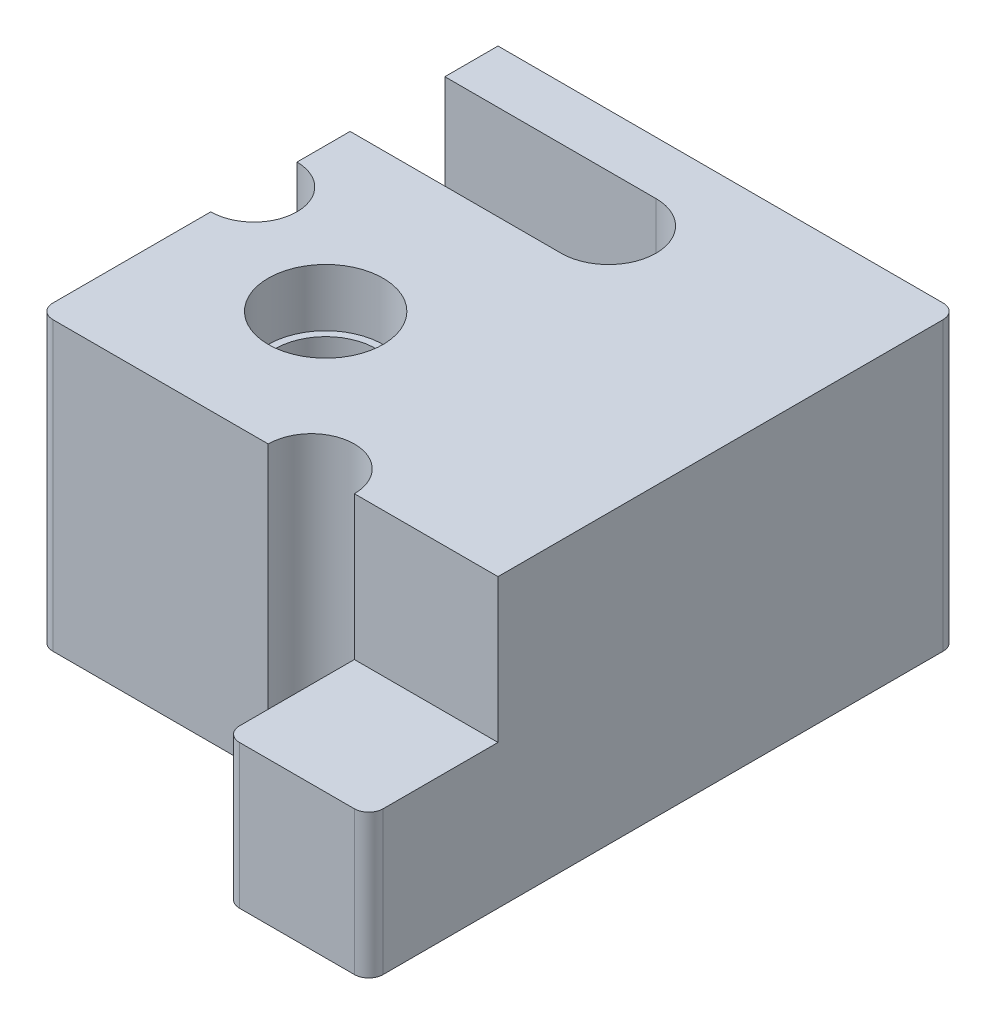
ISO-10303-21;
HEADER;
FILE_DESCRIPTION(('STEP AP214'),'2;1');
FILE_NAME('part.step','',(''),(''),'','','');
FILE_SCHEMA(('AUTOMOTIVE_DESIGN { 1 0 10303 214 1 1 1 1 }'));
ENDSEC;
DATA;
#1=APPLICATION_CONTEXT('core data for automotive mechanical design processes');
#2=APPLICATION_PROTOCOL_DEFINITION('international standard','automotive_design',2000,#1);
#3=PRODUCT_CONTEXT('',#1,'mechanical');
#4=PRODUCT('Part','Part','',(#3));
#5=PRODUCT_RELATED_PRODUCT_CATEGORY('part','',(#4));
#6=PRODUCT_DEFINITION_FORMATION('','',#4);
#7=PRODUCT_DEFINITION_CONTEXT('part definition',#1,'design');
#8=PRODUCT_DEFINITION('design','',#6,#7);
#9=PRODUCT_DEFINITION_SHAPE('','',#8);
#10=(LENGTH_UNIT() NAMED_UNIT(*) SI_UNIT(.MILLI.,.METRE.));
#11=(NAMED_UNIT(*) PLANE_ANGLE_UNIT() SI_UNIT($,.RADIAN.));
#12=(NAMED_UNIT(*) SI_UNIT($,.STERADIAN.) SOLID_ANGLE_UNIT());
#13=UNCERTAINTY_MEASURE_WITH_UNIT(LENGTH_MEASURE(1.E-05),#10,'distance_accuracy_value','');
#14=(GEOMETRIC_REPRESENTATION_CONTEXT(3) GLOBAL_UNCERTAINTY_ASSIGNED_CONTEXT((#13)) GLOBAL_UNIT_ASSIGNED_CONTEXT((#10,
#11,#12)) REPRESENTATION_CONTEXT('',''));
#15=CARTESIAN_POINT('',(0.,0.,0.));
#16=DIRECTION('',(0.,0.,1.));
#17=DIRECTION('',(1.,0.,0.));
#18=AXIS2_PLACEMENT_3D('',#15,#16,#17);
#19=CARTESIAN_POINT('',(1.,5.,7.));
#20=DIRECTION('',(1.,0.,0.));
#21=DIRECTION('',(0.,0.,-1.));
#22=AXIS2_PLACEMENT_3D('',#19,#20,#21);
#23=PLANE('',#22);
#24=DIRECTION('',(0.,0.,-1.));
#25=VECTOR('',#24,1.);
#26=CARTESIAN_POINT('',(1.,10.,7.));
#27=LINE('',#26,#25);
#28=CARTESIAN_POINT('',(1.,10.,7.));
#29=VERTEX_POINT('',#28);
#30=CARTESIAN_POINT('',(1.,10.,5.15));
#31=VERTEX_POINT('',#30);
#32=EDGE_CURVE('E272',#29,#31,#27,.T.);
#33=ORIENTED_EDGE('',*,*,#32,.T.);
#34=DIRECTION('',(0.,-1.,0.));
#35=VECTOR('',#34,1.);
#36=CARTESIAN_POINT('',(1.,5.,5.15));
#37=LINE('',#36,#35);
#38=CARTESIAN_POINT('',(1.,5.,5.15));
#39=VERTEX_POINT('',#38);
#40=EDGE_CURVE('E254',#31,#39,#37,.T.);
#41=ORIENTED_EDGE('',*,*,#40,.T.);
#42=DIRECTION('',(0.,0.,-1.));
#43=VECTOR('',#42,1.);
#44=CARTESIAN_POINT('',(1.,5.,7.));
#45=LINE('',#44,#43);
#46=CARTESIAN_POINT('',(1.,5.,7.));
#47=VERTEX_POINT('',#46);
#48=EDGE_CURVE('E258',#47,#39,#45,.T.);
#49=ORIENTED_EDGE('',*,*,#48,.F.);
#50=DIRECTION('',(0.,-1.,0.));
#51=VECTOR('',#50,1.);
#52=CARTESIAN_POINT('',(1.,10.,7.));
#53=LINE('',#52,#51);
#54=EDGE_CURVE('E351',#29,#47,#53,.T.);
#55=ORIENTED_EDGE('',*,*,#54,.F.);
#56=EDGE_LOOP('',(#33,#41,#49,#55));
#57=FACE_BOUND('',#56,.T.);
#58=ADVANCED_FACE('F34',(#57),#23,.F.);
#59=CARTESIAN_POINT('',(0.,5.,0.));
#60=DIRECTION('',(0.,1.,0.));
#61=DIRECTION('',(0.,0.,1.));
#62=AXIS2_PLACEMENT_3D('',#59,#60,#61);
#63=PLANE('',#62);
#64=DIRECTION('',(1.,0.,0.));
#65=VECTOR('',#64,1.);
#66=CARTESIAN_POINT('',(0.,5.,5.15));
#67=LINE('',#66,#65);
#68=CARTESIAN_POINT('',(0.5,5.,5.15));
#69=VERTEX_POINT('',#68);
#70=EDGE_CURVE('E358',#69,#39,#67,.T.);
#71=ORIENTED_EDGE('',*,*,#70,.F.);
#72=CARTESIAN_POINT('',(0.5,5.,5.65));
#73=DIRECTION('',(0.,1.,0.));
#74=DIRECTION('',(0.,0.,1.));
#75=AXIS2_PLACEMENT_3D('',#72,#73,#74);
#76=CIRCLE('',#75,0.5);
#77=CARTESIAN_POINT('',(0.,5.,5.65));
#78=VERTEX_POINT('',#77);
#79=EDGE_CURVE('E367',#69,#78,#76,.T.);
#80=ORIENTED_EDGE('',*,*,#79,.T.);
#81=DIRECTION('',(0.,0.,1.));
#82=VECTOR('',#81,1.);
#83=CARTESIAN_POINT('',(0.,5.,7.));
#84=LINE('',#83,#82);
#85=CARTESIAN_POINT('',(0.,5.,6.5));
#86=VERTEX_POINT('',#85);
#87=EDGE_CURVE('E265',#78,#86,#84,.T.);
#88=ORIENTED_EDGE('',*,*,#87,.T.);
#89=CARTESIAN_POINT('',(0.500000000000001,5.,6.5));
#90=DIRECTION('',(0.,1.,0.));
#91=DIRECTION('',(0.,0.,1.));
#92=AXIS2_PLACEMENT_3D('',#89,#90,#91);
#93=CIRCLE('',#92,0.5);
#94=CARTESIAN_POINT('',(0.500000000000001,5.,7.));
#95=VERTEX_POINT('',#94);
#96=EDGE_CURVE('E365',#86,#95,#93,.T.);
#97=ORIENTED_EDGE('',*,*,#96,.T.);
#98=DIRECTION('',(1.,0.,0.));
#99=VECTOR('',#98,1.);
#100=CARTESIAN_POINT('',(1.,5.,7.));
#101=LINE('',#100,#99);
#102=EDGE_CURVE('E269',#95,#47,#101,.T.);
#103=ORIENTED_EDGE('',*,*,#102,.T.);
#104=ORIENTED_EDGE('',*,*,#48,.T.);
#105=EDGE_LOOP('',(#71,#80,#88,#97,#103,#104));
#106=FACE_BOUND('',#105,.T.);
#107=ADVANCED_FACE('F438',(#106),#63,.T.);
#108=CARTESIAN_POINT('',(0.,10.,0.));
#109=DIRECTION('',(1.,0.,0.));
#110=DIRECTION('',(0.,0.,-1.));
#111=AXIS2_PLACEMENT_3D('',#108,#109,#110);
#112=PLANE('',#111);
#113=ORIENTED_EDGE('',*,*,#87,.F.);
#114=DIRECTION('',(0.,1.,0.));
#115=VECTOR('',#114,1.);
#116=CARTESIAN_POINT('',(0.,10.,5.65));
#117=LINE('',#116,#115);
#118=CARTESIAN_POINT('',(0.,1.,5.65));
#119=VERTEX_POINT('',#118);
#120=EDGE_CURVE('E377',#78,#119,#117,.F.);
#121=ORIENTED_EDGE('',*,*,#120,.T.);
#122=DIRECTION('',(0.,0.,1.));
#123=VECTOR('',#122,1.);
#124=CARTESIAN_POINT('',(0.,1.,0.));
#125=LINE('',#124,#123);
#126=CARTESIAN_POINT('',(0.,1.,1.35));
#127=VERTEX_POINT('',#126);
#128=EDGE_CURVE('E360',#127,#119,#125,.T.);
#129=ORIENTED_EDGE('',*,*,#128,.F.);
#130=DIRECTION('',(0.,1.,0.));
#131=VECTOR('',#130,1.);
#132=CARTESIAN_POINT('',(0.,10.,1.35));
#133=LINE('',#132,#131);
#134=CARTESIAN_POINT('',(0.,5.,1.35));
#135=VERTEX_POINT('',#134);
#136=EDGE_CURVE('E374',#127,#135,#133,.T.);
#137=ORIENTED_EDGE('',*,*,#136,.T.);
#138=CARTESIAN_POINT('',(0.,5.,0.500000000000002));
#139=VERTEX_POINT('',#138);
#140=EDGE_CURVE('E266',#139,#135,#84,.T.);
#141=ORIENTED_EDGE('',*,*,#140,.F.);
#142=DIRECTION('',(0.,-1.,0.));
#143=VECTOR('',#142,1.);
#144=CARTESIAN_POINT('',(0.,10.,0.5));
#145=LINE('',#144,#143);
#146=CARTESIAN_POINT('',(0.,0.,0.5));
#147=VERTEX_POINT('',#146);
#148=EDGE_CURVE('E371',#139,#147,#145,.T.);
#149=ORIENTED_EDGE('',*,*,#148,.T.);
#150=DIRECTION('',(0.,0.,1.));
#151=VECTOR('',#150,1.);
#152=CARTESIAN_POINT('',(0.,0.,0.));
#153=LINE('',#152,#151);
#154=CARTESIAN_POINT('',(0.,0.,6.5));
#155=VERTEX_POINT('',#154);
#156=EDGE_CURVE('E335',#147,#155,#153,.T.);
#157=ORIENTED_EDGE('',*,*,#156,.T.);
#158=DIRECTION('',(0.,-1.,0.));
#159=VECTOR('',#158,1.);
#160=CARTESIAN_POINT('',(0.,10.,6.5));
#161=LINE('',#160,#159);
#162=EDGE_CURVE('E369',#155,#86,#161,.F.);
#163=ORIENTED_EDGE('',*,*,#162,.T.);
#164=EDGE_LOOP('',(#113,#121,#129,#137,#141,#149,#157,#163));
#165=FACE_BOUND('',#164,.T.);
#166=ADVANCED_FACE('F441',(#165),#112,.F.);
#167=CARTESIAN_POINT('',(1.,10.,7.));
#168=DIRECTION('',(0.,0.,-1.));
#169=DIRECTION('',(-1.,0.,0.));
#170=AXIS2_PLACEMENT_3D('',#167,#168,#169);
#171=PLANE('',#170);
#172=ORIENTED_EDGE('',*,*,#102,.F.);
#173=DIRECTION('',(0.,-1.,0.));
#174=VECTOR('',#173,1.);
#175=CARTESIAN_POINT('',(0.500000000000001,10.,7.));
#176=LINE('',#175,#174);
#177=CARTESIAN_POINT('',(0.500000000000001,0.,7.));
#178=VERTEX_POINT('',#177);
#179=EDGE_CURVE('E402',#95,#178,#176,.T.);
#180=ORIENTED_EDGE('',*,*,#179,.T.);
#181=DIRECTION('',(1.,0.,0.));
#182=VECTOR('',#181,1.);
#183=CARTESIAN_POINT('',(1.,0.,7.));
#184=LINE('',#183,#182);
#185=CARTESIAN_POINT('',(1.,0.,7.));
#186=VERTEX_POINT('',#185);
#187=EDGE_CURVE('E338',#178,#186,#184,.T.);
#188=ORIENTED_EDGE('',*,*,#187,.T.);
#189=EDGE_CURVE('E350',#47,#186,#53,.T.);
#190=ORIENTED_EDGE('',*,*,#189,.F.);
#191=EDGE_LOOP('',(#172,#180,#188,#190));
#192=FACE_BOUND('',#191,.T.);
#193=ADVANCED_FACE('F451',(#192),#171,.F.);
#194=CARTESIAN_POINT('',(12.,10.,16.));
#195=DIRECTION('',(1.,0.,0.));
#196=DIRECTION('',(0.,0.,-1.));
#197=AXIS2_PLACEMENT_3D('',#194,#195,#196);
#198=PLANE('',#197);
#199=DIRECTION('',(0.,0.,1.));
#200=VECTOR('',#199,1.);
#201=CARTESIAN_POINT('',(12.,0.,16.));
#202=LINE('',#201,#200);
#203=CARTESIAN_POINT('',(12.,0.,16.));
#204=VERTEX_POINT('',#203);
#205=CARTESIAN_POINT('',(12.,0.,20.));
#206=VERTEX_POINT('',#205);
#207=EDGE_CURVE('E345',#204,#206,#202,.T.);
#208=ORIENTED_EDGE('',*,*,#207,.T.);
#209=DIRECTION('',(0.,-1.,0.));
#210=VECTOR('',#209,1.);
#211=CARTESIAN_POINT('',(12.,10.,20.));
#212=LINE('',#211,#210);
#213=CARTESIAN_POINT('',(12.,5.,20.));
#214=VERTEX_POINT('',#213);
#215=EDGE_CURVE('E49',#206,#214,#212,.F.);
#216=ORIENTED_EDGE('',*,*,#215,.T.);
#217=DIRECTION('',(0.,0.,1.));
#218=VECTOR('',#217,1.);
#219=CARTESIAN_POINT('',(12.,5.,16.));
#220=LINE('',#219,#218);
#221=CARTESIAN_POINT('',(12.,5.,16.));
#222=VERTEX_POINT('',#221);
#223=EDGE_CURVE('E278',#222,#214,#220,.T.);
#224=ORIENTED_EDGE('',*,*,#223,.F.);
#225=DIRECTION('',(0.,-1.,0.));
#226=VECTOR('',#225,1.);
#227=CARTESIAN_POINT('',(12.,10.,16.));
#228=LINE('',#227,#226);
#229=EDGE_CURVE('E329',#222,#204,#228,.T.);
#230=ORIENTED_EDGE('',*,*,#229,.T.);
#231=EDGE_LOOP('',(#208,#216,#224,#230));
#232=FACE_BOUND('',#231,.T.);
#233=ADVANCED_FACE('F535',(#232),#198,.F.);
#234=CARTESIAN_POINT('',(17.,10.,20.5));
#235=DIRECTION('',(0.,0.,-1.));
#236=DIRECTION('',(-1.,0.,0.));
#237=AXIS2_PLACEMENT_3D('',#234,#235,#236);
#238=PLANE('',#237);
#239=DIRECTION('',(1.,0.,0.));
#240=VECTOR('',#239,1.);
#241=CARTESIAN_POINT('',(12.,5.,20.5));
#242=LINE('',#241,#240);
#243=CARTESIAN_POINT('',(12.5,5.,20.5));
#244=VERTEX_POINT('',#243);
#245=CARTESIAN_POINT('',(16.5,5.,20.5));
#246=VERTEX_POINT('',#245);
#247=EDGE_CURVE('E280',#244,#246,#242,.T.);
#248=ORIENTED_EDGE('',*,*,#247,.F.);
#249=DIRECTION('',(0.,-1.,0.));
#250=VECTOR('',#249,1.);
#251=CARTESIAN_POINT('',(12.5,10.,20.5));
#252=LINE('',#251,#250);
#253=CARTESIAN_POINT('',(12.5,0.,20.5));
#254=VERTEX_POINT('',#253);
#255=EDGE_CURVE('E415',#244,#254,#252,.T.);
#256=ORIENTED_EDGE('',*,*,#255,.T.);
#257=DIRECTION('',(1.,0.,0.));
#258=VECTOR('',#257,1.);
#259=CARTESIAN_POINT('',(17.,0.,20.5));
#260=LINE('',#259,#258);
#261=CARTESIAN_POINT('',(16.5,0.,20.5));
#262=VERTEX_POINT('',#261);
#263=EDGE_CURVE('E322',#254,#262,#260,.T.);
#264=ORIENTED_EDGE('',*,*,#263,.T.);
#265=DIRECTION('',(0.,-1.,0.));
#266=VECTOR('',#265,1.);
#267=CARTESIAN_POINT('',(16.5,10.,20.5));
#268=LINE('',#267,#266);
#269=EDGE_CURVE('E57',#262,#246,#268,.F.);
#270=ORIENTED_EDGE('',*,*,#269,.T.);
#271=EDGE_LOOP('',(#248,#256,#264,#270));
#272=FACE_BOUND('',#271,.T.);
#273=ADVANCED_FACE('F525',(#272),#238,.F.);
#274=CARTESIAN_POINT('',(6.,0.,11.));
#275=DIRECTION('',(0.,1.,0.));
#276=DIRECTION('',(0.,0.,1.));
#277=AXIS2_PLACEMENT_3D('',#274,#275,#276);
#278=CYLINDRICAL_SURFACE('',#277,1.75);
#279=CARTESIAN_POINT('',(6.,0.,11.));
#280=DIRECTION('',(0.,1.,0.));
#281=DIRECTION('',(0.,0.,1.));
#282=AXIS2_PLACEMENT_3D('',#279,#280,#281);
#283=CIRCLE('',#282,1.75);
#284=CARTESIAN_POINT('',(6.,0.,12.75));
#285=VERTEX_POINT('',#284);
#286=EDGE_CURVE('E314',#285,#285,#283,.T.);
#287=ORIENTED_EDGE('',*,*,#286,.F.);
#288=EDGE_LOOP('',(#287));
#289=FACE_BOUND('',#288,.T.);
#290=CARTESIAN_POINT('',(6.,8.,11.));
#291=DIRECTION('',(0.,1.,0.));
#292=DIRECTION('',(0.,0.,1.));
#293=AXIS2_PLACEMENT_3D('',#290,#291,#292);
#294=CIRCLE('',#293,1.75);
#295=CARTESIAN_POINT('',(6.,8.,12.75));
#296=VERTEX_POINT('',#295);
#297=EDGE_CURVE('E311',#296,#296,#294,.F.);
#298=ORIENTED_EDGE('',*,*,#297,.F.);
#299=EDGE_LOOP('',(#298));
#300=FACE_BOUND('',#299,.T.);
#301=ADVANCED_FACE('F706',(#289,#300),#278,.F.);
#302=CARTESIAN_POINT('',(17.,10.,0.));
#303=DIRECTION('',(-1.,0.,0.));
#304=DIRECTION('',(0.,0.,1.));
#305=AXIS2_PLACEMENT_3D('',#302,#303,#304);
#306=PLANE('',#305);
#307=DIRECTION('',(0.,0.,-1.));
#308=VECTOR('',#307,1.);
#309=CARTESIAN_POINT('',(17.,0.,0.));
#310=LINE('',#309,#308);
#311=CARTESIAN_POINT('',(17.,0.,20.));
#312=VERTEX_POINT('',#311);
#313=CARTESIAN_POINT('',(17.,0.,0.5));
#314=VERTEX_POINT('',#313);
#315=EDGE_CURVE('E317',#312,#314,#310,.T.);
#316=ORIENTED_EDGE('',*,*,#315,.T.);
#317=DIRECTION('',(0.,-1.,0.));
#318=VECTOR('',#317,1.);
#319=CARTESIAN_POINT('',(17.,10.,0.5));
#320=LINE('',#319,#318);
#321=CARTESIAN_POINT('',(17.,10.,0.5));
#322=VERTEX_POINT('',#321);
#323=EDGE_CURVE('E408',#314,#322,#320,.F.);
#324=ORIENTED_EDGE('',*,*,#323,.T.);
#325=DIRECTION('',(0.,0.,-1.));
#326=VECTOR('',#325,1.);
#327=CARTESIAN_POINT('',(17.,10.,0.));
#328=LINE('',#327,#326);
#329=CARTESIAN_POINT('',(17.,10.,16.));
#330=VERTEX_POINT('',#329);
#331=EDGE_CURVE('E318',#330,#322,#328,.T.);
#332=ORIENTED_EDGE('',*,*,#331,.F.);
#333=DIRECTION('',(0.,1.,0.));
#334=VECTOR('',#333,1.);
#335=CARTESIAN_POINT('',(17.,5.,16.));
#336=LINE('',#335,#334);
#337=CARTESIAN_POINT('',(17.,5.,16.));
#338=VERTEX_POINT('',#337);
#339=EDGE_CURVE('E287',#338,#330,#336,.T.);
#340=ORIENTED_EDGE('',*,*,#339,.F.);
#341=DIRECTION('',(0.,0.,-1.));
#342=VECTOR('',#341,1.);
#343=CARTESIAN_POINT('',(17.,5.,16.));
#344=LINE('',#343,#342);
#345=CARTESIAN_POINT('',(17.,5.,20.));
#346=VERTEX_POINT('',#345);
#347=EDGE_CURVE('E282',#346,#338,#344,.T.);
#348=ORIENTED_EDGE('',*,*,#347,.F.);
#349=DIRECTION('',(0.,-1.,0.));
#350=VECTOR('',#349,1.);
#351=CARTESIAN_POINT('',(17.,10.,20.));
#352=LINE('',#351,#350);
#353=EDGE_CURVE('E405',#346,#312,#352,.T.);
#354=ORIENTED_EDGE('',*,*,#353,.T.);
#355=EDGE_LOOP('',(#316,#324,#332,#340,#348,#354));
#356=FACE_BOUND('',#355,.T.);
#357=ADVANCED_FACE('F512',(#356),#306,.F.);
#358=CARTESIAN_POINT('',(0.,10.,0.));
#359=DIRECTION('',(0.,0.,1.));
#360=DIRECTION('',(1.,0.,0.));
#361=AXIS2_PLACEMENT_3D('',#358,#359,#360);
#362=PLANE('',#361);
#363=DIRECTION('',(-1.,0.,0.));
#364=VECTOR('',#363,1.);
#365=CARTESIAN_POINT('',(0.,0.,0.));
#366=LINE('',#365,#364);
#367=CARTESIAN_POINT('',(16.5,0.,0.));
#368=VERTEX_POINT('',#367);
#369=CARTESIAN_POINT('',(0.5,0.,0.));
#370=VERTEX_POINT('',#369);
#371=EDGE_CURVE('E332',#368,#370,#366,.T.);
#372=ORIENTED_EDGE('',*,*,#371,.T.);
#373=DIRECTION('',(0.,-1.,0.));
#374=VECTOR('',#373,1.);
#375=CARTESIAN_POINT('',(0.5,10.,0.));
#376=LINE('',#375,#374);
#377=CARTESIAN_POINT('',(0.5,5.,0.));
#378=VERTEX_POINT('',#377);
#379=EDGE_CURVE('E400',#370,#378,#376,.F.);
#380=ORIENTED_EDGE('',*,*,#379,.T.);
#381=DIRECTION('',(-1.,0.,0.));
#382=VECTOR('',#381,1.);
#383=CARTESIAN_POINT('',(1.,5.,0.));
#384=LINE('',#383,#382);
#385=CARTESIAN_POINT('',(1.,5.,0.));
#386=VERTEX_POINT('',#385);
#387=EDGE_CURVE('E261',#386,#378,#384,.T.);
#388=ORIENTED_EDGE('',*,*,#387,.F.);
#389=DIRECTION('',(0.,1.,0.));
#390=VECTOR('',#389,1.);
#391=CARTESIAN_POINT('',(1.,5.,0.));
#392=LINE('',#391,#390);
#393=CARTESIAN_POINT('',(1.,10.,0.));
#394=VERTEX_POINT('',#393);
#395=EDGE_CURVE('E271',#386,#394,#392,.T.);
#396=ORIENTED_EDGE('',*,*,#395,.T.);
#397=DIRECTION('',(-1.,0.,0.));
#398=VECTOR('',#397,1.);
#399=CARTESIAN_POINT('',(0.,10.,0.));
#400=LINE('',#399,#398);
#401=CARTESIAN_POINT('',(16.5,10.,0.));
#402=VERTEX_POINT('',#401);
#403=EDGE_CURVE('E321',#402,#394,#400,.T.);
#404=ORIENTED_EDGE('',*,*,#403,.F.);
#405=DIRECTION('',(0.,-1.,0.));
#406=VECTOR('',#405,1.);
#407=CARTESIAN_POINT('',(16.5,10.,0.));
#408=LINE('',#407,#406);
#409=EDGE_CURVE('E397',#402,#368,#408,.T.);
#410=ORIENTED_EDGE('',*,*,#409,.T.);
#411=EDGE_LOOP('',(#372,#380,#388,#396,#404,#410));
#412=FACE_BOUND('',#411,.T.);
#413=ADVANCED_FACE('F521',(#412),#362,.F.);
#414=CARTESIAN_POINT('',(1.,10.,7.));
#415=DIRECTION('',(1.,0.,0.));
#416=DIRECTION('',(0.,0.,-1.));
#417=AXIS2_PLACEMENT_3D('',#414,#415,#416);
#418=PLANE('',#417);
#419=DIRECTION('',(0.,0.,1.));
#420=VECTOR('',#419,1.);
#421=CARTESIAN_POINT('',(1.,0.,7.));
#422=LINE('',#421,#420);
#423=CARTESIAN_POINT('',(1.,0.,10.));
#424=VERTEX_POINT('',#423);
#425=CARTESIAN_POINT('',(1.,0.,15.5));
#426=VERTEX_POINT('',#425);
#427=EDGE_CURVE('E340',#424,#426,#422,.T.);
#428=ORIENTED_EDGE('',*,*,#427,.T.);
#429=DIRECTION('',(0.,-1.,0.));
#430=VECTOR('',#429,1.);
#431=CARTESIAN_POINT('',(1.,10.,15.5));
#432=LINE('',#431,#430);
#433=CARTESIAN_POINT('',(1.,10.,15.5));
#434=VERTEX_POINT('',#433);
#435=EDGE_CURVE('E426',#426,#434,#432,.F.);
#436=ORIENTED_EDGE('',*,*,#435,.T.);
#437=DIRECTION('',(0.,0.,1.));
#438=VECTOR('',#437,1.);
#439=CARTESIAN_POINT('',(1.,10.,7.));
#440=LINE('',#439,#438);
#441=CARTESIAN_POINT('',(1.,10.,10.));
#442=VERTEX_POINT('',#441);
#443=EDGE_CURVE('E324',#442,#434,#440,.T.);
#444=ORIENTED_EDGE('',*,*,#443,.F.);
#445=DIRECTION('',(0.,-1.,0.));
#446=VECTOR('',#445,1.);
#447=CARTESIAN_POINT('',(1.,10.,10.));
#448=LINE('',#447,#446);
#449=EDGE_CURVE('E303',#442,#424,#448,.T.);
#450=ORIENTED_EDGE('',*,*,#449,.T.);
#451=EDGE_LOOP('',(#428,#436,#444,#450));
#452=FACE_BOUND('',#451,.T.);
#453=ADVANCED_FACE('F489',(#452),#418,.F.);
#454=CARTESIAN_POINT('',(1.,10.,16.));
#455=DIRECTION('',(0.,0.,-1.));
#456=DIRECTION('',(-1.,0.,0.));
#457=AXIS2_PLACEMENT_3D('',#454,#455,#456);
#458=PLANE('',#457);
#459=DIRECTION('',(1.,0.,0.));
#460=VECTOR('',#459,1.);
#461=CARTESIAN_POINT('',(1.,10.,16.));
#462=LINE('',#461,#460);
#463=CARTESIAN_POINT('',(1.5,10.,16.));
#464=VERTEX_POINT('',#463);
#465=CARTESIAN_POINT('',(9.00000000000001,10.,16.));
#466=VERTEX_POINT('',#465);
#467=EDGE_CURVE('E327',#464,#466,#462,.T.);
#468=ORIENTED_EDGE('',*,*,#467,.F.);
#469=DIRECTION('',(0.,-1.,0.));
#470=VECTOR('',#469,1.);
#471=CARTESIAN_POINT('',(1.5,10.,16.));
#472=LINE('',#471,#470);
#473=CARTESIAN_POINT('',(1.5,0.,16.));
#474=VERTEX_POINT('',#473);
#475=EDGE_CURVE('E423',#464,#474,#472,.T.);
#476=ORIENTED_EDGE('',*,*,#475,.T.);
#477=DIRECTION('',(1.,0.,0.));
#478=VECTOR('',#477,1.);
#479=CARTESIAN_POINT('',(1.,0.,16.));
#480=LINE('',#479,#478);
#481=CARTESIAN_POINT('',(9.00000000000001,0.,16.));
#482=VERTEX_POINT('',#481);
#483=EDGE_CURVE('E343',#474,#482,#480,.T.);
#484=ORIENTED_EDGE('',*,*,#483,.T.);
#485=DIRECTION('',(0.,-1.,0.));
#486=VECTOR('',#485,1.);
#487=CARTESIAN_POINT('',(9.00000000000001,10.,16.));
#488=LINE('',#487,#486);
#489=EDGE_CURVE('E294',#466,#482,#488,.T.);
#490=ORIENTED_EDGE('',*,*,#489,.F.);
#491=EDGE_LOOP('',(#468,#476,#484,#490));
#492=FACE_BOUND('',#491,.T.);
#493=ADVANCED_FACE('F497',(#492),#458,.F.);
#494=CARTESIAN_POINT('',(17.,10.,20.5));
#495=DIRECTION('',(0.,-1.,0.));
#496=DIRECTION('',(0.,0.,-1.));
#497=AXIS2_PLACEMENT_3D('',#494,#495,#496);
#498=PLANE('',#497);
#499=CARTESIAN_POINT('',(6.,10.,11.));
#500=DIRECTION('',(0.,1.,0.));
#501=DIRECTION('',(0.,0.,1.));
#502=AXIS2_PLACEMENT_3D('',#499,#500,#501);
#503=CIRCLE('',#502,2.);
#504=CARTESIAN_POINT('',(6.,10.,13.));
#505=VERTEX_POINT('',#504);
#506=EDGE_CURVE('E307',#505,#505,#503,.T.);
#507=ORIENTED_EDGE('',*,*,#506,.F.);
#508=EDGE_LOOP('',(#507));
#509=FACE_BOUND('',#508,.T.);
#510=ORIENTED_EDGE('',*,*,#331,.T.);
#511=CARTESIAN_POINT('',(16.5,10.,0.5));
#512=DIRECTION('',(0.,-1.,0.));
#513=DIRECTION('',(0.,0.,-1.));
#514=AXIS2_PLACEMENT_3D('',#511,#512,#513);
#515=CIRCLE('',#514,0.5);
#516=EDGE_CURVE('E412',#322,#402,#515,.F.);
#517=ORIENTED_EDGE('',*,*,#516,.T.);
#518=ORIENTED_EDGE('',*,*,#403,.T.);
#519=CARTESIAN_POINT('',(1.,10.,1.85));
#520=VERTEX_POINT('',#519);
#521=EDGE_CURVE('E257',#520,#394,#27,.T.);
#522=ORIENTED_EDGE('',*,*,#521,.F.);
#523=DIRECTION('',(-1.,0.,0.));
#524=VECTOR('',#523,1.);
#525=CARTESIAN_POINT('',(8.35,10.,1.85));
#526=LINE('',#525,#524);
#527=CARTESIAN_POINT('',(8.35,10.,1.85));
#528=VERTEX_POINT('',#527);
#529=EDGE_CURVE('E244',#528,#520,#526,.T.);
#530=ORIENTED_EDGE('',*,*,#529,.F.);
#531=CARTESIAN_POINT('',(8.35,10.,3.5));
#532=DIRECTION('',(0.,1.,0.));
#533=DIRECTION('',(0.,0.,1.));
#534=AXIS2_PLACEMENT_3D('',#531,#532,#533);
#535=CIRCLE('',#534,1.65);
#536=CARTESIAN_POINT('',(8.35,10.,5.15));
#537=VERTEX_POINT('',#536);
#538=EDGE_CURVE('E224',#537,#528,#535,.T.);
#539=ORIENTED_EDGE('',*,*,#538,.F.);
#540=DIRECTION('',(1.,0.,0.));
#541=VECTOR('',#540,1.);
#542=CARTESIAN_POINT('',(8.35,10.,5.15));
#543=LINE('',#542,#541);
#544=EDGE_CURVE('E242',#31,#537,#543,.T.);
#545=ORIENTED_EDGE('',*,*,#544,.F.);
#546=ORIENTED_EDGE('',*,*,#32,.F.);
#547=CARTESIAN_POINT('',(1.,10.,8.5));
#548=DIRECTION('',(0.,-1.,0.));
#549=DIRECTION('',(0.,0.,-1.));
#550=AXIS2_PLACEMENT_3D('',#547,#548,#549);
#551=CIRCLE('',#550,1.5);
#552=EDGE_CURVE('E300',#29,#442,#551,.T.);
#553=ORIENTED_EDGE('',*,*,#552,.T.);
#554=ORIENTED_EDGE('',*,*,#443,.T.);
#555=CARTESIAN_POINT('',(1.5,10.,15.5));
#556=DIRECTION('',(0.,-1.,0.));
#557=DIRECTION('',(0.,0.,-1.));
#558=AXIS2_PLACEMENT_3D('',#555,#556,#557);
#559=CIRCLE('',#558,0.5);
#560=EDGE_CURVE('E410',#434,#464,#559,.F.);
#561=ORIENTED_EDGE('',*,*,#560,.T.);
#562=ORIENTED_EDGE('',*,*,#467,.T.);
#563=CARTESIAN_POINT('',(10.5,10.,16.));
#564=DIRECTION('',(0.,-1.,0.));
#565=DIRECTION('',(0.,0.,-1.));
#566=AXIS2_PLACEMENT_3D('',#563,#564,#565);
#567=CIRCLE('',#566,1.5);
#568=CARTESIAN_POINT('',(12.,10.,16.));
#569=VERTEX_POINT('',#568);
#570=EDGE_CURVE('E291',#466,#569,#567,.T.);
#571=ORIENTED_EDGE('',*,*,#570,.T.);
#572=DIRECTION('',(-1.,0.,0.));
#573=VECTOR('',#572,1.);
#574=CARTESIAN_POINT('',(12.,10.,16.));
#575=LINE('',#574,#573);
#576=EDGE_CURVE('E277',#330,#569,#575,.T.);
#577=ORIENTED_EDGE('',*,*,#576,.F.);
#578=EDGE_LOOP('',(#510,#517,#518,#522,#530,#539,#545,#546,#553,#554,#561,#562,#571,#577));
#579=FACE_BOUND('',#578,.T.);
#580=ADVANCED_FACE('F462',(#509,#579),#498,.F.);
#581=CARTESIAN_POINT('',(17.,0.,20.5));
#582=DIRECTION('',(0.,-1.,0.));
#583=DIRECTION('',(0.,0.,-1.));
#584=AXIS2_PLACEMENT_3D('',#581,#582,#583);
#585=PLANE('',#584);
#586=ORIENTED_EDGE('',*,*,#156,.F.);
#587=CARTESIAN_POINT('',(0.5,0.,0.5));
#588=DIRECTION('',(0.,-1.,0.));
#589=DIRECTION('',(0.,0.,-1.));
#590=AXIS2_PLACEMENT_3D('',#587,#588,#589);
#591=CIRCLE('',#590,0.5);
#592=EDGE_CURVE('E395',#147,#370,#591,.T.);
#593=ORIENTED_EDGE('',*,*,#592,.T.);
#594=ORIENTED_EDGE('',*,*,#371,.F.);
#595=CARTESIAN_POINT('',(16.5,0.,0.5));
#596=DIRECTION('',(0.,-1.,0.));
#597=DIRECTION('',(0.,0.,-1.));
#598=AXIS2_PLACEMENT_3D('',#595,#596,#597);
#599=CIRCLE('',#598,0.5);
#600=EDGE_CURVE('E391',#368,#314,#599,.T.);
#601=ORIENTED_EDGE('',*,*,#600,.T.);
#602=ORIENTED_EDGE('',*,*,#315,.F.);
#603=CARTESIAN_POINT('',(16.5,0.,20.));
#604=DIRECTION('',(0.,-1.,0.));
#605=DIRECTION('',(0.,0.,-1.));
#606=AXIS2_PLACEMENT_3D('',#603,#604,#605);
#607=CIRCLE('',#606,0.5);
#608=EDGE_CURVE('E387',#312,#262,#607,.T.);
#609=ORIENTED_EDGE('',*,*,#608,.T.);
#610=ORIENTED_EDGE('',*,*,#263,.F.);
#611=CARTESIAN_POINT('',(12.5,0.,20.));
#612=DIRECTION('',(0.,-1.,0.));
#613=DIRECTION('',(0.,0.,-1.));
#614=AXIS2_PLACEMENT_3D('',#611,#612,#613);
#615=CIRCLE('',#614,0.5);
#616=EDGE_CURVE('E389',#254,#206,#615,.T.);
#617=ORIENTED_EDGE('',*,*,#616,.T.);
#618=ORIENTED_EDGE('',*,*,#207,.F.);
#619=CARTESIAN_POINT('',(10.5,0.,16.));
#620=DIRECTION('',(0.,-1.,0.));
#621=DIRECTION('',(0.,0.,-1.));
#622=AXIS2_PLACEMENT_3D('',#619,#620,#621);
#623=CIRCLE('',#622,1.5);
#624=EDGE_CURVE('E290',#482,#204,#623,.T.);
#625=ORIENTED_EDGE('',*,*,#624,.F.);
#626=ORIENTED_EDGE('',*,*,#483,.F.);
#627=CARTESIAN_POINT('',(1.5,0.,15.5));
#628=DIRECTION('',(0.,-1.,0.));
#629=DIRECTION('',(0.,0.,-1.));
#630=AXIS2_PLACEMENT_3D('',#627,#628,#629);
#631=CIRCLE('',#630,0.5);
#632=EDGE_CURVE('E385',#474,#426,#631,.T.);
#633=ORIENTED_EDGE('',*,*,#632,.T.);
#634=ORIENTED_EDGE('',*,*,#427,.F.);
#635=CARTESIAN_POINT('',(1.,0.,8.5));
#636=DIRECTION('',(0.,-1.,0.));
#637=DIRECTION('',(0.,0.,-1.));
#638=AXIS2_PLACEMENT_3D('',#635,#636,#637);
#639=CIRCLE('',#638,1.5);
#640=EDGE_CURVE('E299',#186,#424,#639,.T.);
#641=ORIENTED_EDGE('',*,*,#640,.F.);
#642=ORIENTED_EDGE('',*,*,#187,.F.);
#643=CARTESIAN_POINT('',(0.500000000000001,0.,6.5));
#644=DIRECTION('',(0.,-1.,0.));
#645=DIRECTION('',(0.,0.,-1.));
#646=AXIS2_PLACEMENT_3D('',#643,#644,#645);
#647=CIRCLE('',#646,0.5);
#648=EDGE_CURVE('E393',#178,#155,#647,.T.);
#649=ORIENTED_EDGE('',*,*,#648,.T.);
#650=EDGE_LOOP('',(#586,#593,#594,#601,#602,#609,#610,#617,#618,#625,#626,#633,#634,#641,#642,#649));
#651=FACE_BOUND('',#650,.T.);
#652=ORIENTED_EDGE('',*,*,#286,.T.);
#653=EDGE_LOOP('',(#652));
#654=FACE_BOUND('',#653,.T.);
#655=ADVANCED_FACE('F484',(#651,#654),#585,.T.);
#656=CARTESIAN_POINT('',(6.,8.,11.));
#657=DIRECTION('',(0.,1.,0.));
#658=DIRECTION('',(0.,0.,1.));
#659=AXIS2_PLACEMENT_3D('',#656,#657,#658);
#660=PLANE('',#659);
#661=CARTESIAN_POINT('',(6.,8.,11.));
#662=DIRECTION('',(0.,1.,0.));
#663=DIRECTION('',(0.,0.,1.));
#664=AXIS2_PLACEMENT_3D('',#661,#662,#663);
#665=CIRCLE('',#664,2.);
#666=CARTESIAN_POINT('',(6.,8.,13.));
#667=VERTEX_POINT('',#666);
#668=EDGE_CURVE('E308',#667,#667,#665,.T.);
#669=ORIENTED_EDGE('',*,*,#668,.T.);
#670=EDGE_LOOP('',(#669));
#671=FACE_BOUND('',#670,.T.);
#672=ORIENTED_EDGE('',*,*,#297,.T.);
#673=EDGE_LOOP('',(#672));
#674=FACE_BOUND('',#673,.T.);
#675=ADVANCED_FACE('F727',(#671,#674),#660,.T.);
#676=CARTESIAN_POINT('',(6.,8.,11.));
#677=DIRECTION('',(0.,1.,0.));
#678=DIRECTION('',(0.,0.,1.));
#679=AXIS2_PLACEMENT_3D('',#676,#677,#678);
#680=CYLINDRICAL_SURFACE('',#679,2.);
#681=ORIENTED_EDGE('',*,*,#668,.F.);
#682=EDGE_LOOP('',(#681));
#683=FACE_BOUND('',#682,.T.);
#684=ORIENTED_EDGE('',*,*,#506,.T.);
#685=EDGE_LOOP('',(#684));
#686=FACE_BOUND('',#685,.T.);
#687=ADVANCED_FACE('F719',(#683,#686),#680,.F.);
#688=CARTESIAN_POINT('',(1.,10.,8.5));
#689=DIRECTION('',(0.,-1.,0.));
#690=DIRECTION('',(0.,0.,-1.));
#691=AXIS2_PLACEMENT_3D('',#688,#689,#690);
#692=CYLINDRICAL_SURFACE('',#691,1.5);
#693=ORIENTED_EDGE('',*,*,#640,.T.);
#694=ORIENTED_EDGE('',*,*,#449,.F.);
#695=ORIENTED_EDGE('',*,*,#552,.F.);
#696=ORIENTED_EDGE('',*,*,#54,.T.);
#697=ORIENTED_EDGE('',*,*,#189,.T.);
#698=EDGE_LOOP('',(#693,#694,#695,#696,#697));
#699=FACE_BOUND('',#698,.T.);
#700=ADVANCED_FACE('F457',(#699),#692,.F.);
#701=CARTESIAN_POINT('',(10.5,10.,16.));
#702=DIRECTION('',(0.,-1.,0.));
#703=DIRECTION('',(0.,0.,-1.));
#704=AXIS2_PLACEMENT_3D('',#701,#702,#703);
#705=CYLINDRICAL_SURFACE('',#704,1.5);
#706=ORIENTED_EDGE('',*,*,#624,.T.);
#707=ORIENTED_EDGE('',*,*,#229,.F.);
#708=EDGE_CURVE('E348',#569,#222,#228,.T.);
#709=ORIENTED_EDGE('',*,*,#708,.F.);
#710=ORIENTED_EDGE('',*,*,#570,.F.);
#711=ORIENTED_EDGE('',*,*,#489,.T.);
#712=EDGE_LOOP('',(#706,#707,#709,#710,#711));
#713=FACE_BOUND('',#712,.T.);
#714=ADVANCED_FACE('F503',(#713),#705,.F.);
#715=CARTESIAN_POINT('',(12.,5.,16.));
#716=DIRECTION('',(0.,0.,-1.));
#717=DIRECTION('',(-1.,0.,0.));
#718=AXIS2_PLACEMENT_3D('',#715,#716,#717);
#719=PLANE('',#718);
#720=ORIENTED_EDGE('',*,*,#576,.T.);
#721=ORIENTED_EDGE('',*,*,#708,.T.);
#722=DIRECTION('',(-1.,0.,0.));
#723=VECTOR('',#722,1.);
#724=CARTESIAN_POINT('',(12.,5.,16.));
#725=LINE('',#724,#723);
#726=EDGE_CURVE('E284',#338,#222,#725,.T.);
#727=ORIENTED_EDGE('',*,*,#726,.F.);
#728=ORIENTED_EDGE('',*,*,#339,.T.);
#729=EDGE_LOOP('',(#720,#721,#727,#728));
#730=FACE_BOUND('',#729,.T.);
#731=ADVANCED_FACE('F536',(#730),#719,.F.);
#732=CARTESIAN_POINT('',(0.,5.,0.));
#733=DIRECTION('',(0.,1.,0.));
#734=DIRECTION('',(0.,0.,1.));
#735=AXIS2_PLACEMENT_3D('',#732,#733,#734);
#736=PLANE('',#735);
#737=ORIENTED_EDGE('',*,*,#223,.T.);
#738=CARTESIAN_POINT('',(12.5,5.,20.));
#739=DIRECTION('',(0.,1.,0.));
#740=DIRECTION('',(0.,0.,1.));
#741=AXIS2_PLACEMENT_3D('',#738,#739,#740);
#742=CIRCLE('',#741,0.5);
#743=EDGE_CURVE('E421',#214,#244,#742,.T.);
#744=ORIENTED_EDGE('',*,*,#743,.T.);
#745=ORIENTED_EDGE('',*,*,#247,.T.);
#746=CARTESIAN_POINT('',(16.5,5.,20.));
#747=DIRECTION('',(0.,1.,0.));
#748=DIRECTION('',(0.,0.,1.));
#749=AXIS2_PLACEMENT_3D('',#746,#747,#748);
#750=CIRCLE('',#749,0.5);
#751=EDGE_CURVE('E419',#246,#346,#750,.T.);
#752=ORIENTED_EDGE('',*,*,#751,.T.);
#753=ORIENTED_EDGE('',*,*,#347,.T.);
#754=ORIENTED_EDGE('',*,*,#726,.T.);
#755=EDGE_LOOP('',(#737,#744,#745,#752,#753,#754));
#756=FACE_BOUND('',#755,.T.);
#757=ADVANCED_FACE('F530',(#756),#736,.T.);
#758=CARTESIAN_POINT('',(1.,5.,1.85));
#759=VERTEX_POINT('',#758);
#760=EDGE_CURVE('E262',#759,#386,#45,.T.);
#761=ORIENTED_EDGE('',*,*,#760,.F.);
#762=DIRECTION('',(0.,1.,0.));
#763=VECTOR('',#762,1.);
#764=CARTESIAN_POINT('',(1.,5.,1.85));
#765=LINE('',#764,#763);
#766=EDGE_CURVE('E250',#759,#520,#765,.T.);
#767=ORIENTED_EDGE('',*,*,#766,.T.);
#768=ORIENTED_EDGE('',*,*,#521,.T.);
#769=ORIENTED_EDGE('',*,*,#395,.F.);
#770=EDGE_LOOP('',(#761,#767,#768,#769));
#771=FACE_BOUND('',#770,.T.);
#772=ADVANCED_FACE('F469',(#771),#23,.F.);
#773=ORIENTED_EDGE('',*,*,#140,.T.);
#774=CARTESIAN_POINT('',(0.5,5.,1.35));
#775=DIRECTION('',(0.,1.,0.));
#776=DIRECTION('',(0.,0.,1.));
#777=AXIS2_PLACEMENT_3D('',#774,#775,#776);
#778=CIRCLE('',#777,0.5);
#779=CARTESIAN_POINT('',(0.5,5.,1.85));
#780=VERTEX_POINT('',#779);
#781=EDGE_CURVE('E382',#135,#780,#778,.T.);
#782=ORIENTED_EDGE('',*,*,#781,.T.);
#783=DIRECTION('',(-1.,0.,0.));
#784=VECTOR('',#783,1.);
#785=CARTESIAN_POINT('',(0.,5.,1.85));
#786=LINE('',#785,#784);
#787=EDGE_CURVE('E354',#759,#780,#786,.T.);
#788=ORIENTED_EDGE('',*,*,#787,.F.);
#789=ORIENTED_EDGE('',*,*,#760,.T.);
#790=ORIENTED_EDGE('',*,*,#387,.T.);
#791=CARTESIAN_POINT('',(0.5,5.,0.5));
#792=DIRECTION('',(0.,1.,0.));
#793=DIRECTION('',(0.,0.,1.));
#794=AXIS2_PLACEMENT_3D('',#791,#792,#793);
#795=CIRCLE('',#794,0.5);
#796=EDGE_CURVE('E380',#378,#139,#795,.T.);
#797=ORIENTED_EDGE('',*,*,#796,.T.);
#798=EDGE_LOOP('',(#773,#782,#788,#789,#790,#797));
#799=FACE_BOUND('',#798,.T.);
#800=ADVANCED_FACE('F473',(#799),#63,.T.);
#801=CARTESIAN_POINT('',(8.35,1.,3.5));
#802=DIRECTION('',(0.,1.,0.));
#803=DIRECTION('',(0.,0.,1.));
#804=AXIS2_PLACEMENT_3D('',#801,#802,#803);
#805=PLANE('',#804);
#806=ORIENTED_EDGE('',*,*,#128,.T.);
#807=CARTESIAN_POINT('',(0.5,1.,5.65));
#808=DIRECTION('',(0.,1.,0.));
#809=DIRECTION('',(0.,0.,1.));
#810=AXIS2_PLACEMENT_3D('',#807,#808,#809);
#811=CIRCLE('',#810,0.5);
#812=CARTESIAN_POINT('',(0.5,1.,5.15));
#813=VERTEX_POINT('',#812);
#814=EDGE_CURVE('E42',#119,#813,#811,.F.);
#815=ORIENTED_EDGE('',*,*,#814,.T.);
#816=DIRECTION('',(1.,0.,0.));
#817=VECTOR('',#816,1.);
#818=CARTESIAN_POINT('',(8.35,1.,5.15));
#819=LINE('',#818,#817);
#820=CARTESIAN_POINT('',(8.35,1.,5.15));
#821=VERTEX_POINT('',#820);
#822=EDGE_CURVE('E228',#813,#821,#819,.T.);
#823=ORIENTED_EDGE('',*,*,#822,.T.);
#824=CARTESIAN_POINT('',(8.35,1.,3.5));
#825=DIRECTION('',(0.,1.,0.));
#826=DIRECTION('',(0.,0.,1.));
#827=AXIS2_PLACEMENT_3D('',#824,#825,#826);
#828=CIRCLE('',#827,1.65);
#829=CARTESIAN_POINT('',(8.35,1.,1.85));
#830=VERTEX_POINT('',#829);
#831=EDGE_CURVE('E222',#821,#830,#828,.T.);
#832=ORIENTED_EDGE('',*,*,#831,.T.);
#833=DIRECTION('',(-1.,0.,0.));
#834=VECTOR('',#833,1.);
#835=CARTESIAN_POINT('',(8.35,1.,1.85));
#836=LINE('',#835,#834);
#837=CARTESIAN_POINT('',(0.5,1.,1.85));
#838=VERTEX_POINT('',#837);
#839=EDGE_CURVE('E231',#830,#838,#836,.T.);
#840=ORIENTED_EDGE('',*,*,#839,.T.);
#841=CARTESIAN_POINT('',(0.5,1.,1.35));
#842=DIRECTION('',(0.,1.,0.));
#843=DIRECTION('',(0.,0.,1.));
#844=AXIS2_PLACEMENT_3D('',#841,#842,#843);
#845=CIRCLE('',#844,0.5);
#846=EDGE_CURVE('E11',#838,#127,#845,.F.);
#847=ORIENTED_EDGE('',*,*,#846,.T.);
#848=EDGE_LOOP('',(#806,#815,#823,#832,#840,#847));
#849=FACE_BOUND('',#848,.T.);
#850=ADVANCED_FACE('F239',(#849),#805,.T.);
#851=CARTESIAN_POINT('',(8.35,1.,5.15));
#852=DIRECTION('',(0.,0.,1.));
#853=DIRECTION('',(1.,0.,0.));
#854=AXIS2_PLACEMENT_3D('',#851,#852,#853);
#855=PLANE('',#854);
#856=ORIENTED_EDGE('',*,*,#822,.F.);
#857=DIRECTION('',(0.,1.,0.));
#858=VECTOR('',#857,1.);
#859=CARTESIAN_POINT('',(0.5,1.,5.15));
#860=LINE('',#859,#858);
#861=EDGE_CURVE('E362',#813,#69,#860,.T.);
#862=ORIENTED_EDGE('',*,*,#861,.T.);
#863=ORIENTED_EDGE('',*,*,#70,.T.);
#864=ORIENTED_EDGE('',*,*,#40,.F.);
#865=ORIENTED_EDGE('',*,*,#544,.T.);
#866=DIRECTION('',(0.,1.,0.));
#867=VECTOR('',#866,1.);
#868=CARTESIAN_POINT('',(8.35,1.,5.15));
#869=LINE('',#868,#867);
#870=EDGE_CURVE('E227',#821,#537,#869,.T.);
#871=ORIENTED_EDGE('',*,*,#870,.F.);
#872=EDGE_LOOP('',(#856,#862,#863,#864,#865,#871));
#873=FACE_BOUND('',#872,.T.);
#874=ADVANCED_FACE('F432',(#873),#855,.F.);
#875=CARTESIAN_POINT('',(8.35,1.,1.85));
#876=DIRECTION('',(0.,0.,-1.));
#877=DIRECTION('',(-1.,0.,0.));
#878=AXIS2_PLACEMENT_3D('',#875,#876,#877);
#879=PLANE('',#878);
#880=ORIENTED_EDGE('',*,*,#787,.T.);
#881=DIRECTION('',(0.,1.,0.));
#882=VECTOR('',#881,1.);
#883=CARTESIAN_POINT('',(0.5,1.,1.85));
#884=LINE('',#883,#882);
#885=EDGE_CURVE('E235',#780,#838,#884,.F.);
#886=ORIENTED_EDGE('',*,*,#885,.T.);
#887=ORIENTED_EDGE('',*,*,#839,.F.);
#888=DIRECTION('',(0.,1.,0.));
#889=VECTOR('',#888,1.);
#890=CARTESIAN_POINT('',(8.35,1.,1.85));
#891=LINE('',#890,#889);
#892=EDGE_CURVE('E217',#830,#528,#891,.T.);
#893=ORIENTED_EDGE('',*,*,#892,.T.);
#894=ORIENTED_EDGE('',*,*,#529,.T.);
#895=ORIENTED_EDGE('',*,*,#766,.F.);
#896=EDGE_LOOP('',(#880,#886,#887,#893,#894,#895));
#897=FACE_BOUND('',#896,.T.);
#898=ADVANCED_FACE('F233',(#897),#879,.F.);
#899=CARTESIAN_POINT('',(8.35,1.,3.5));
#900=DIRECTION('',(0.,1.,0.));
#901=DIRECTION('',(0.,0.,1.));
#902=AXIS2_PLACEMENT_3D('',#899,#900,#901);
#903=CYLINDRICAL_SURFACE('',#902,1.65);
#904=ORIENTED_EDGE('',*,*,#538,.T.);
#905=ORIENTED_EDGE('',*,*,#892,.F.);
#906=ORIENTED_EDGE('',*,*,#831,.F.);
#907=ORIENTED_EDGE('',*,*,#870,.T.);
#908=EDGE_LOOP('',(#904,#905,#906,#907));
#909=FACE_BOUND('',#908,.T.);
#910=ADVANCED_FACE('F219',(#909),#903,.F.);
#911=CARTESIAN_POINT('',(0.5,1.,5.65));
#912=DIRECTION('',(0.,1.,0.));
#913=DIRECTION('',(0.,0.,1.));
#914=AXIS2_PLACEMENT_3D('',#911,#912,#913);
#915=CYLINDRICAL_SURFACE('',#914,0.5);
#916=ORIENTED_EDGE('',*,*,#814,.F.);
#917=ORIENTED_EDGE('',*,*,#120,.F.);
#918=ORIENTED_EDGE('',*,*,#79,.F.);
#919=ORIENTED_EDGE('',*,*,#861,.F.);
#920=EDGE_LOOP('',(#916,#917,#918,#919));
#921=FACE_BOUND('',#920,.T.);
#922=ADVANCED_FACE('F434',(#921),#915,.T.);
#923=CARTESIAN_POINT('',(0.5,10.,1.35));
#924=DIRECTION('',(0.,1.,0.));
#925=DIRECTION('',(0.,0.,1.));
#926=AXIS2_PLACEMENT_3D('',#923,#924,#925);
#927=CYLINDRICAL_SURFACE('',#926,0.5);
#928=ORIENTED_EDGE('',*,*,#846,.F.);
#929=ORIENTED_EDGE('',*,*,#885,.F.);
#930=ORIENTED_EDGE('',*,*,#781,.F.);
#931=ORIENTED_EDGE('',*,*,#136,.F.);
#932=EDGE_LOOP('',(#928,#929,#930,#931));
#933=FACE_BOUND('',#932,.T.);
#934=ADVANCED_FACE('F476',(#933),#927,.T.);
#935=CARTESIAN_POINT('',(0.5,10.,0.5));
#936=DIRECTION('',(0.,-1.,0.));
#937=DIRECTION('',(0.,0.,-1.));
#938=AXIS2_PLACEMENT_3D('',#935,#936,#937);
#939=CYLINDRICAL_SURFACE('',#938,0.5);
#940=ORIENTED_EDGE('',*,*,#796,.F.);
#941=ORIENTED_EDGE('',*,*,#379,.F.);
#942=ORIENTED_EDGE('',*,*,#592,.F.);
#943=ORIENTED_EDGE('',*,*,#148,.F.);
#944=EDGE_LOOP('',(#940,#941,#942,#943));
#945=FACE_BOUND('',#944,.T.);
#946=ADVANCED_FACE('F482',(#945),#939,.T.);
#947=CARTESIAN_POINT('',(0.500000000000001,10.,6.5));
#948=DIRECTION('',(0.,-1.,0.));
#949=DIRECTION('',(0.,0.,-1.));
#950=AXIS2_PLACEMENT_3D('',#947,#948,#949);
#951=CYLINDRICAL_SURFACE('',#950,0.5);
#952=ORIENTED_EDGE('',*,*,#96,.F.);
#953=ORIENTED_EDGE('',*,*,#162,.F.);
#954=ORIENTED_EDGE('',*,*,#648,.F.);
#955=ORIENTED_EDGE('',*,*,#179,.F.);
#956=EDGE_LOOP('',(#952,#953,#954,#955));
#957=FACE_BOUND('',#956,.T.);
#958=ADVANCED_FACE('F445',(#957),#951,.T.);
#959=CARTESIAN_POINT('',(16.5,10.,0.5));
#960=DIRECTION('',(0.,-1.,0.));
#961=DIRECTION('',(0.,0.,-1.));
#962=AXIS2_PLACEMENT_3D('',#959,#960,#961);
#963=CYLINDRICAL_SURFACE('',#962,0.5);
#964=ORIENTED_EDGE('',*,*,#516,.F.);
#965=ORIENTED_EDGE('',*,*,#323,.F.);
#966=ORIENTED_EDGE('',*,*,#600,.F.);
#967=ORIENTED_EDGE('',*,*,#409,.F.);
#968=EDGE_LOOP('',(#964,#965,#966,#967));
#969=FACE_BOUND('',#968,.T.);
#970=ADVANCED_FACE('F517',(#969),#963,.T.);
#971=CARTESIAN_POINT('',(12.5,10.,20.));
#972=DIRECTION('',(0.,-1.,0.));
#973=DIRECTION('',(0.,0.,-1.));
#974=AXIS2_PLACEMENT_3D('',#971,#972,#973);
#975=CYLINDRICAL_SURFACE('',#974,0.5);
#976=ORIENTED_EDGE('',*,*,#743,.F.);
#977=ORIENTED_EDGE('',*,*,#215,.F.);
#978=ORIENTED_EDGE('',*,*,#616,.F.);
#979=ORIENTED_EDGE('',*,*,#255,.F.);
#980=EDGE_LOOP('',(#976,#977,#978,#979));
#981=FACE_BOUND('',#980,.T.);
#982=ADVANCED_FACE('F534',(#981),#975,.T.);
#983=CARTESIAN_POINT('',(16.5,10.,20.));
#984=DIRECTION('',(0.,-1.,0.));
#985=DIRECTION('',(0.,0.,-1.));
#986=AXIS2_PLACEMENT_3D('',#983,#984,#985);
#987=CYLINDRICAL_SURFACE('',#986,0.5);
#988=ORIENTED_EDGE('',*,*,#751,.F.);
#989=ORIENTED_EDGE('',*,*,#269,.F.);
#990=ORIENTED_EDGE('',*,*,#608,.F.);
#991=ORIENTED_EDGE('',*,*,#353,.F.);
#992=EDGE_LOOP('',(#988,#989,#990,#991));
#993=FACE_BOUND('',#992,.T.);
#994=ADVANCED_FACE('F528',(#993),#987,.T.);
#995=CARTESIAN_POINT('',(1.5,10.,15.5));
#996=DIRECTION('',(0.,-1.,0.));
#997=DIRECTION('',(0.,0.,-1.));
#998=AXIS2_PLACEMENT_3D('',#995,#996,#997);
#999=CYLINDRICAL_SURFACE('',#998,0.5);
#1000=ORIENTED_EDGE('',*,*,#560,.F.);
#1001=ORIENTED_EDGE('',*,*,#435,.F.);
#1002=ORIENTED_EDGE('',*,*,#632,.F.);
#1003=ORIENTED_EDGE('',*,*,#475,.F.);
#1004=EDGE_LOOP('',(#1000,#1001,#1002,#1003));
#1005=FACE_BOUND('',#1004,.T.);
#1006=ADVANCED_FACE('F36',(#1005),#999,.T.);
#1007=CLOSED_SHELL('',(#58,#107,#166,#193,#233,#273,#301,#357,#413,#453,#493,#580,#655,#675,
#687,#700,#714,#731,#757,#772,#800,#850,#874,#898,#910,#922,#934,#946,#958,#970,#982,#994,#1006));
#1008=MANIFOLD_SOLID_BREP('B2',#1007);
#1009=ADVANCED_BREP_SHAPE_REPRESENTATION('',(#18,#1008),#14);
#1010=SHAPE_DEFINITION_REPRESENTATION(#9,#1009);
ENDSEC;
END-ISO-10303-21;
